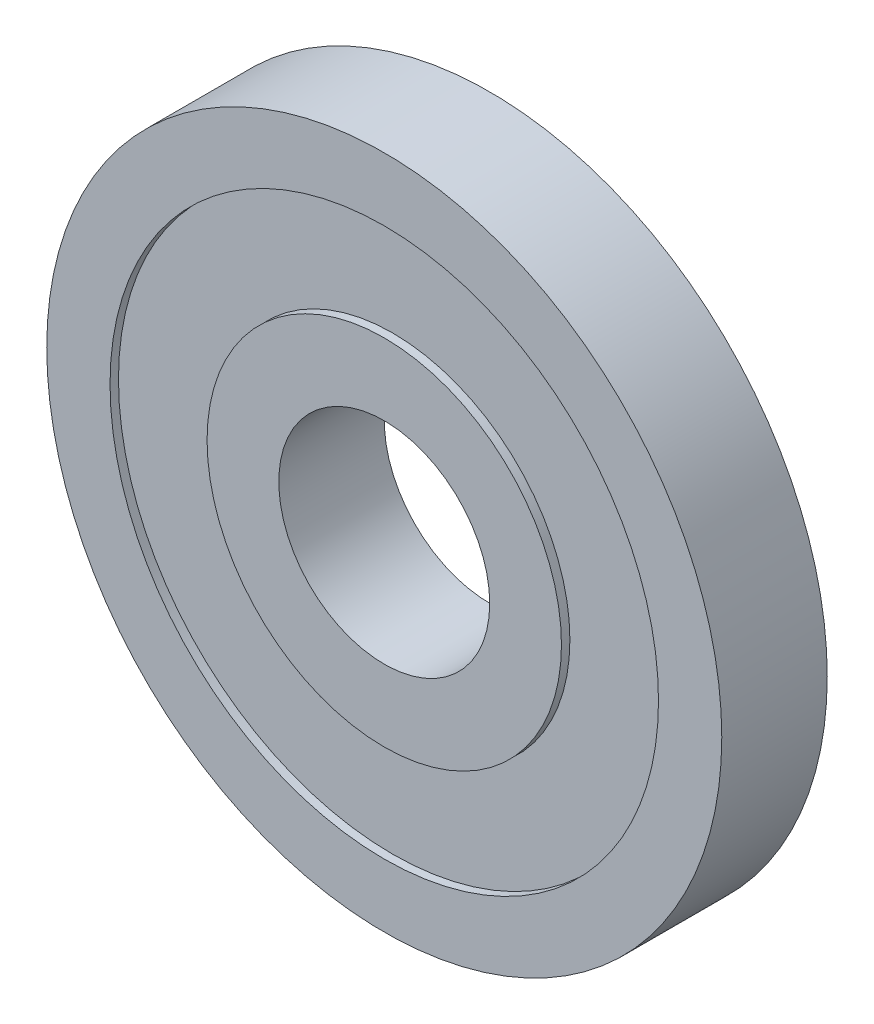
ISO-10303-21;
HEADER;
FILE_DESCRIPTION(('STEP AP214'),'2;1');
FILE_NAME('part.step','',(''),(''),'','','');
FILE_SCHEMA(('AUTOMOTIVE_DESIGN { 1 0 10303 214 1 1 1 1 }'));
ENDSEC;
DATA;
#1=APPLICATION_CONTEXT('core data for automotive mechanical design processes');
#2=APPLICATION_PROTOCOL_DEFINITION('international standard','automotive_design',2000,#1);
#3=PRODUCT_CONTEXT('',#1,'mechanical');
#4=PRODUCT('Part','Part','',(#3));
#5=PRODUCT_RELATED_PRODUCT_CATEGORY('part','',(#4));
#6=PRODUCT_DEFINITION_FORMATION('','',#4);
#7=PRODUCT_DEFINITION_CONTEXT('part definition',#1,'design');
#8=PRODUCT_DEFINITION('design','',#6,#7);
#9=PRODUCT_DEFINITION_SHAPE('','',#8);
#10=(LENGTH_UNIT() NAMED_UNIT(*) SI_UNIT(.MILLI.,.METRE.));
#11=(NAMED_UNIT(*) PLANE_ANGLE_UNIT() SI_UNIT($,.RADIAN.));
#12=(NAMED_UNIT(*) SI_UNIT($,.STERADIAN.) SOLID_ANGLE_UNIT());
#13=UNCERTAINTY_MEASURE_WITH_UNIT(LENGTH_MEASURE(1.E-05),#10,'distance_accuracy_value','');
#14=(GEOMETRIC_REPRESENTATION_CONTEXT(3) GLOBAL_UNCERTAINTY_ASSIGNED_CONTEXT((#13)) GLOBAL_UNIT_ASSIGNED_CONTEXT((#10,
#11,#12)) REPRESENTATION_CONTEXT('',''));
#15=CARTESIAN_POINT('',(0.,0.,0.));
#16=DIRECTION('',(0.,0.,1.));
#17=DIRECTION('',(1.,0.,0.));
#18=AXIS2_PLACEMENT_3D('',#15,#16,#17);
#19=CARTESIAN_POINT('',(4.2,0.,0.));
#20=DIRECTION('',(0.,0.,1.));
#21=DIRECTION('',(1.,0.,0.));
#22=AXIS2_PLACEMENT_3D('',#19,#20,#21);
#23=PLANE('',#22);
#24=CARTESIAN_POINT('',(0.,0.,0.));
#25=DIRECTION('',(0.,0.,1.));
#26=DIRECTION('',(1.,0.,0.));
#27=AXIS2_PLACEMENT_3D('',#24,#25,#26);
#28=CIRCLE('',#27,4.2);
#29=CARTESIAN_POINT('',(4.2,0.,0.));
#30=VERTEX_POINT('',#29);
#31=EDGE_CURVE('E10',#30,#30,#28,.T.);
#32=ORIENTED_EDGE('',*,*,#31,.T.);
#33=EDGE_LOOP('',(#32));
#34=FACE_BOUND('',#33,.T.);
#35=CARTESIAN_POINT('',(0.,0.,0.));
#36=DIRECTION('',(0.,0.,1.));
#37=DIRECTION('',(1.,0.,0.));
#38=AXIS2_PLACEMENT_3D('',#35,#36,#37);
#39=CIRCLE('',#38,2.5);
#40=CARTESIAN_POINT('',(2.5,0.,0.));
#41=VERTEX_POINT('',#40);
#42=EDGE_CURVE('E72',#41,#41,#39,.T.);
#43=ORIENTED_EDGE('',*,*,#42,.F.);
#44=EDGE_LOOP('',(#43));
#45=FACE_BOUND('',#44,.T.);
#46=ADVANCED_FACE('F32',(#34,#45),#23,.T.);
#47=CARTESIAN_POINT('',(0.,0.,0.));
#48=DIRECTION('',(0.,0.,1.));
#49=DIRECTION('',(1.,0.,0.));
#50=AXIS2_PLACEMENT_3D('',#47,#48,#49);
#51=CYLINDRICAL_SURFACE('',#50,4.2);
#52=CARTESIAN_POINT('',(0.,0.,-0.2));
#53=DIRECTION('',(0.,0.,1.));
#54=DIRECTION('',(1.,0.,0.));
#55=AXIS2_PLACEMENT_3D('',#52,#53,#54);
#56=CIRCLE('',#55,4.2);
#57=CARTESIAN_POINT('',(4.2,0.,-0.2));
#58=VERTEX_POINT('',#57);
#59=EDGE_CURVE('E38',#58,#58,#56,.T.);
#60=ORIENTED_EDGE('',*,*,#59,.T.);
#61=EDGE_LOOP('',(#60));
#62=FACE_BOUND('',#61,.T.);
#63=ORIENTED_EDGE('',*,*,#31,.F.);
#64=EDGE_LOOP('',(#63));
#65=FACE_BOUND('',#64,.T.);
#66=ADVANCED_FACE('F80',(#62,#65),#51,.T.);
#67=CARTESIAN_POINT('',(4.2,0.,-0.2));
#68=DIRECTION('',(0.,0.,1.));
#69=DIRECTION('',(1.,0.,0.));
#70=AXIS2_PLACEMENT_3D('',#67,#68,#69);
#71=PLANE('',#70);
#72=CARTESIAN_POINT('',(0.,0.,-0.2));
#73=DIRECTION('',(0.,0.,1.));
#74=DIRECTION('',(1.,0.,0.));
#75=AXIS2_PLACEMENT_3D('',#72,#73,#74);
#76=CIRCLE('',#75,6.5);
#77=CARTESIAN_POINT('',(6.5,0.,-0.2));
#78=VERTEX_POINT('',#77);
#79=EDGE_CURVE('E42',#78,#78,#76,.T.);
#80=ORIENTED_EDGE('',*,*,#79,.T.);
#81=EDGE_LOOP('',(#80));
#82=FACE_BOUND('',#81,.T.);
#83=ORIENTED_EDGE('',*,*,#59,.F.);
#84=EDGE_LOOP('',(#83));
#85=FACE_BOUND('',#84,.T.);
#86=ADVANCED_FACE('F84',(#82,#85),#71,.T.);
#87=CARTESIAN_POINT('',(0.,0.,0.));
#88=DIRECTION('',(0.,0.,1.));
#89=DIRECTION('',(1.,0.,0.));
#90=AXIS2_PLACEMENT_3D('',#87,#88,#89);
#91=CYLINDRICAL_SURFACE('',#90,6.5);
#92=CARTESIAN_POINT('',(0.,0.,0.));
#93=DIRECTION('',(0.,0.,1.));
#94=DIRECTION('',(1.,0.,0.));
#95=AXIS2_PLACEMENT_3D('',#92,#93,#94);
#96=CIRCLE('',#95,6.5);
#97=CARTESIAN_POINT('',(6.5,0.,0.));
#98=VERTEX_POINT('',#97);
#99=EDGE_CURVE('E46',#98,#98,#96,.T.);
#100=ORIENTED_EDGE('',*,*,#99,.T.);
#101=EDGE_LOOP('',(#100));
#102=FACE_BOUND('',#101,.T.);
#103=ORIENTED_EDGE('',*,*,#79,.F.);
#104=EDGE_LOOP('',(#103));
#105=FACE_BOUND('',#104,.T.);
#106=ADVANCED_FACE('F88',(#102,#105),#91,.F.);
#107=CARTESIAN_POINT('',(8.,0.,0.));
#108=DIRECTION('',(0.,0.,1.));
#109=DIRECTION('',(1.,0.,0.));
#110=AXIS2_PLACEMENT_3D('',#107,#108,#109);
#111=PLANE('',#110);
#112=CARTESIAN_POINT('',(0.,0.,0.));
#113=DIRECTION('',(0.,0.,1.));
#114=DIRECTION('',(1.,0.,0.));
#115=AXIS2_PLACEMENT_3D('',#112,#113,#114);
#116=CIRCLE('',#115,8.);
#117=CARTESIAN_POINT('',(8.,0.,0.));
#118=VERTEX_POINT('',#117);
#119=EDGE_CURVE('E51',#118,#118,#116,.T.);
#120=ORIENTED_EDGE('',*,*,#119,.T.);
#121=EDGE_LOOP('',(#120));
#122=FACE_BOUND('',#121,.T.);
#123=ORIENTED_EDGE('',*,*,#99,.F.);
#124=EDGE_LOOP('',(#123));
#125=FACE_BOUND('',#124,.T.);
#126=ADVANCED_FACE('F95',(#122,#125),#111,.T.);
#127=CARTESIAN_POINT('',(0.,0.,0.));
#128=DIRECTION('',(0.,0.,1.));
#129=DIRECTION('',(1.,0.,0.));
#130=AXIS2_PLACEMENT_3D('',#127,#128,#129);
#131=CYLINDRICAL_SURFACE('',#130,8.);
#132=CARTESIAN_POINT('',(0.,0.,-2.5));
#133=DIRECTION('',(0.,0.,1.));
#134=DIRECTION('',(1.,0.,0.));
#135=AXIS2_PLACEMENT_3D('',#132,#133,#134);
#136=CIRCLE('',#135,8.);
#137=CARTESIAN_POINT('',(8.,0.,-2.5));
#138=VERTEX_POINT('',#137);
#139=EDGE_CURVE('E54',#138,#138,#136,.T.);
#140=ORIENTED_EDGE('',*,*,#139,.T.);
#141=EDGE_LOOP('',(#140));
#142=FACE_BOUND('',#141,.T.);
#143=ORIENTED_EDGE('',*,*,#119,.F.);
#144=EDGE_LOOP('',(#143));
#145=FACE_BOUND('',#144,.T.);
#146=ADVANCED_FACE('F99',(#142,#145),#131,.T.);
#147=CARTESIAN_POINT('',(6.5,0.,-2.5));
#148=DIRECTION('',(0.,0.,-1.));
#149=DIRECTION('',(-1.,0.,0.));
#150=AXIS2_PLACEMENT_3D('',#147,#148,#149);
#151=PLANE('',#150);
#152=CARTESIAN_POINT('',(0.,0.,-2.5));
#153=DIRECTION('',(0.,0.,1.));
#154=DIRECTION('',(1.,0.,0.));
#155=AXIS2_PLACEMENT_3D('',#152,#153,#154);
#156=CIRCLE('',#155,6.5);
#157=CARTESIAN_POINT('',(6.5,0.,-2.5));
#158=VERTEX_POINT('',#157);
#159=EDGE_CURVE('E57',#158,#158,#156,.T.);
#160=ORIENTED_EDGE('',*,*,#159,.T.);
#161=EDGE_LOOP('',(#160));
#162=FACE_BOUND('',#161,.T.);
#163=ORIENTED_EDGE('',*,*,#139,.F.);
#164=EDGE_LOOP('',(#163));
#165=FACE_BOUND('',#164,.T.);
#166=ADVANCED_FACE('F103',(#162,#165),#151,.T.);
#167=CARTESIAN_POINT('',(0.,0.,0.));
#168=DIRECTION('',(0.,0.,1.));
#169=DIRECTION('',(1.,0.,0.));
#170=AXIS2_PLACEMENT_3D('',#167,#168,#169);
#171=CYLINDRICAL_SURFACE('',#170,6.5);
#172=CARTESIAN_POINT('',(0.,0.,-2.3));
#173=DIRECTION('',(0.,0.,1.));
#174=DIRECTION('',(1.,0.,0.));
#175=AXIS2_PLACEMENT_3D('',#172,#173,#174);
#176=CIRCLE('',#175,6.5);
#177=CARTESIAN_POINT('',(6.5,0.,-2.3));
#178=VERTEX_POINT('',#177);
#179=EDGE_CURVE('E60',#178,#178,#176,.T.);
#180=ORIENTED_EDGE('',*,*,#179,.T.);
#181=EDGE_LOOP('',(#180));
#182=FACE_BOUND('',#181,.T.);
#183=ORIENTED_EDGE('',*,*,#159,.F.);
#184=EDGE_LOOP('',(#183));
#185=FACE_BOUND('',#184,.T.);
#186=ADVANCED_FACE('F107',(#182,#185),#171,.F.);
#187=CARTESIAN_POINT('',(4.2,0.,-2.3));
#188=DIRECTION('',(0.,0.,-1.));
#189=DIRECTION('',(-1.,0.,0.));
#190=AXIS2_PLACEMENT_3D('',#187,#188,#189);
#191=PLANE('',#190);
#192=CARTESIAN_POINT('',(0.,0.,-2.3));
#193=DIRECTION('',(0.,0.,1.));
#194=DIRECTION('',(1.,0.,0.));
#195=AXIS2_PLACEMENT_3D('',#192,#193,#194);
#196=CIRCLE('',#195,4.2);
#197=CARTESIAN_POINT('',(4.2,0.,-2.3));
#198=VERTEX_POINT('',#197);
#199=EDGE_CURVE('E63',#198,#198,#196,.T.);
#200=ORIENTED_EDGE('',*,*,#199,.T.);
#201=EDGE_LOOP('',(#200));
#202=FACE_BOUND('',#201,.T.);
#203=ORIENTED_EDGE('',*,*,#179,.F.);
#204=EDGE_LOOP('',(#203));
#205=FACE_BOUND('',#204,.T.);
#206=ADVANCED_FACE('F111',(#202,#205),#191,.T.);
#207=CARTESIAN_POINT('',(0.,0.,0.));
#208=DIRECTION('',(0.,0.,1.));
#209=DIRECTION('',(1.,0.,0.));
#210=AXIS2_PLACEMENT_3D('',#207,#208,#209);
#211=CYLINDRICAL_SURFACE('',#210,4.2);
#212=CARTESIAN_POINT('',(0.,0.,-2.5));
#213=DIRECTION('',(0.,0.,1.));
#214=DIRECTION('',(1.,0.,0.));
#215=AXIS2_PLACEMENT_3D('',#212,#213,#214);
#216=CIRCLE('',#215,4.2);
#217=CARTESIAN_POINT('',(4.2,0.,-2.5));
#218=VERTEX_POINT('',#217);
#219=EDGE_CURVE('E66',#218,#218,#216,.T.);
#220=ORIENTED_EDGE('',*,*,#219,.T.);
#221=EDGE_LOOP('',(#220));
#222=FACE_BOUND('',#221,.T.);
#223=ORIENTED_EDGE('',*,*,#199,.F.);
#224=EDGE_LOOP('',(#223));
#225=FACE_BOUND('',#224,.T.);
#226=ADVANCED_FACE('F115',(#222,#225),#211,.T.);
#227=CARTESIAN_POINT('',(2.5,0.,-2.5));
#228=DIRECTION('',(0.,0.,-1.));
#229=DIRECTION('',(-1.,0.,0.));
#230=AXIS2_PLACEMENT_3D('',#227,#228,#229);
#231=PLANE('',#230);
#232=CARTESIAN_POINT('',(0.,0.,-2.5));
#233=DIRECTION('',(0.,0.,1.));
#234=DIRECTION('',(1.,0.,0.));
#235=AXIS2_PLACEMENT_3D('',#232,#233,#234);
#236=CIRCLE('',#235,2.5);
#237=CARTESIAN_POINT('',(2.5,0.,-2.5));
#238=VERTEX_POINT('',#237);
#239=EDGE_CURVE('E69',#238,#238,#236,.T.);
#240=ORIENTED_EDGE('',*,*,#239,.T.);
#241=EDGE_LOOP('',(#240));
#242=FACE_BOUND('',#241,.T.);
#243=ORIENTED_EDGE('',*,*,#219,.F.);
#244=EDGE_LOOP('',(#243));
#245=FACE_BOUND('',#244,.T.);
#246=ADVANCED_FACE('F119',(#242,#245),#231,.T.);
#247=CARTESIAN_POINT('',(0.,0.,0.));
#248=DIRECTION('',(0.,0.,1.));
#249=DIRECTION('',(1.,0.,0.));
#250=AXIS2_PLACEMENT_3D('',#247,#248,#249);
#251=CYLINDRICAL_SURFACE('',#250,2.5);
#252=ORIENTED_EDGE('',*,*,#42,.T.);
#253=EDGE_LOOP('',(#252));
#254=FACE_BOUND('',#253,.T.);
#255=ORIENTED_EDGE('',*,*,#239,.F.);
#256=EDGE_LOOP('',(#255));
#257=FACE_BOUND('',#256,.T.);
#258=ADVANCED_FACE('F76',(#254,#257),#251,.F.);
#259=CLOSED_SHELL('',(#46,#66,#86,#106,#126,#146,#166,#186,#206,#226,#246,#258));
#260=MANIFOLD_SOLID_BREP('B2',#259);
#261=ADVANCED_BREP_SHAPE_REPRESENTATION('',(#18,#260),#14);
#262=SHAPE_DEFINITION_REPRESENTATION(#9,#261);
ENDSEC;
END-ISO-10303-21;
